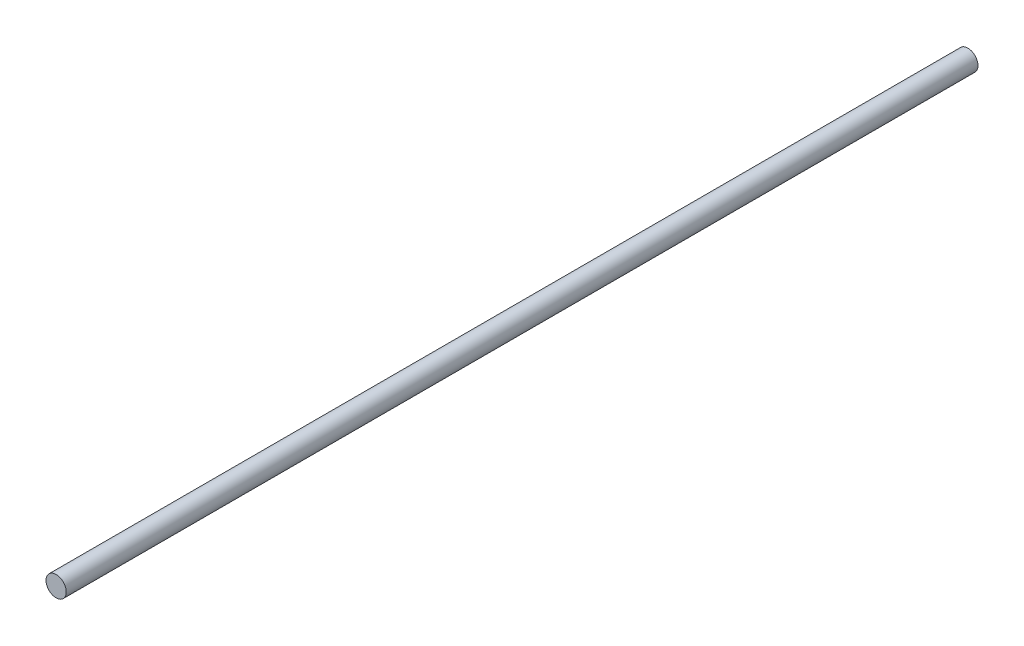
ISO-10303-21;
HEADER;
FILE_DESCRIPTION(('STEP AP214'),'2;1');
FILE_NAME('part.step','',(''),(''),'','','');
FILE_SCHEMA(('AUTOMOTIVE_DESIGN { 1 0 10303 214 1 1 1 1 }'));
ENDSEC;
DATA;
#1=APPLICATION_CONTEXT('core data for automotive mechanical design processes');
#2=APPLICATION_PROTOCOL_DEFINITION('international standard','automotive_design',2000,#1);
#3=PRODUCT_CONTEXT('',#1,'mechanical');
#4=PRODUCT('Part','Part','',(#3));
#5=PRODUCT_RELATED_PRODUCT_CATEGORY('part','',(#4));
#6=PRODUCT_DEFINITION_FORMATION('','',#4);
#7=PRODUCT_DEFINITION_CONTEXT('part definition',#1,'design');
#8=PRODUCT_DEFINITION('design','',#6,#7);
#9=PRODUCT_DEFINITION_SHAPE('','',#8);
#10=(LENGTH_UNIT() NAMED_UNIT(*) SI_UNIT(.MILLI.,.METRE.));
#11=(NAMED_UNIT(*) PLANE_ANGLE_UNIT() SI_UNIT($,.RADIAN.));
#12=(NAMED_UNIT(*) SI_UNIT($,.STERADIAN.) SOLID_ANGLE_UNIT());
#13=UNCERTAINTY_MEASURE_WITH_UNIT(LENGTH_MEASURE(1.E-05),#10,'distance_accuracy_value','');
#14=(GEOMETRIC_REPRESENTATION_CONTEXT(3) GLOBAL_UNCERTAINTY_ASSIGNED_CONTEXT((#13)) GLOBAL_UNIT_ASSIGNED_CONTEXT((#10,
#11,#12)) REPRESENTATION_CONTEXT('',''));
#15=CARTESIAN_POINT('',(0.,0.,0.));
#16=DIRECTION('',(0.,0.,1.));
#17=DIRECTION('',(1.,0.,0.));
#18=AXIS2_PLACEMENT_3D('',#15,#16,#17);
#19=CARTESIAN_POINT('',(0.,0.,135.));
#20=DIRECTION('',(0.,0.,-1.));
#21=DIRECTION('',(-1.,0.,0.));
#22=AXIS2_PLACEMENT_3D('',#19,#20,#21);
#23=CYLINDRICAL_SURFACE('',#22,1.5);
#24=CARTESIAN_POINT('',(0.,0.,135.));
#25=DIRECTION('',(0.,0.,1.));
#26=DIRECTION('',(1.,0.,0.));
#27=AXIS2_PLACEMENT_3D('',#24,#25,#26);
#28=CIRCLE('',#27,1.5);
#29=CARTESIAN_POINT('',(1.5,0.,135.));
#30=VERTEX_POINT('',#29);
#31=EDGE_CURVE('E10',#30,#30,#28,.T.);
#32=ORIENTED_EDGE('',*,*,#31,.F.);
#33=EDGE_LOOP('',(#32));
#34=FACE_BOUND('',#33,.T.);
#35=CARTESIAN_POINT('',(0.,0.,0.));
#36=DIRECTION('',(0.,0.,1.));
#37=DIRECTION('',(1.,0.,0.));
#38=AXIS2_PLACEMENT_3D('',#35,#36,#37);
#39=CIRCLE('',#38,1.5);
#40=CARTESIAN_POINT('',(1.5,0.,0.));
#41=VERTEX_POINT('',#40);
#42=EDGE_CURVE('E35',#41,#41,#39,.T.);
#43=ORIENTED_EDGE('',*,*,#42,.T.);
#44=EDGE_LOOP('',(#43));
#45=FACE_BOUND('',#44,.T.);
#46=ADVANCED_FACE('F32',(#34,#45),#23,.T.);
#47=CARTESIAN_POINT('',(0.,0.,135.));
#48=DIRECTION('',(0.,0.,1.));
#49=DIRECTION('',(1.,0.,0.));
#50=AXIS2_PLACEMENT_3D('',#47,#48,#49);
#51=PLANE('',#50);
#52=ORIENTED_EDGE('',*,*,#31,.T.);
#53=EDGE_LOOP('',(#52));
#54=FACE_BOUND('',#53,.T.);
#55=ADVANCED_FACE('F47',(#54),#51,.T.);
#56=CARTESIAN_POINT('',(0.,0.,0.));
#57=DIRECTION('',(0.,0.,1.));
#58=DIRECTION('',(1.,0.,0.));
#59=AXIS2_PLACEMENT_3D('',#56,#57,#58);
#60=PLANE('',#59);
#61=ORIENTED_EDGE('',*,*,#42,.F.);
#62=EDGE_LOOP('',(#61));
#63=FACE_BOUND('',#62,.T.);
#64=ADVANCED_FACE('F45',(#63),#60,.F.);
#65=CLOSED_SHELL('',(#46,#55,#64));
#66=MANIFOLD_SOLID_BREP('B2',#65);
#67=ADVANCED_BREP_SHAPE_REPRESENTATION('',(#18,#66),#14);
#68=SHAPE_DEFINITION_REPRESENTATION(#9,#67);
ENDSEC;
END-ISO-10303-21;
